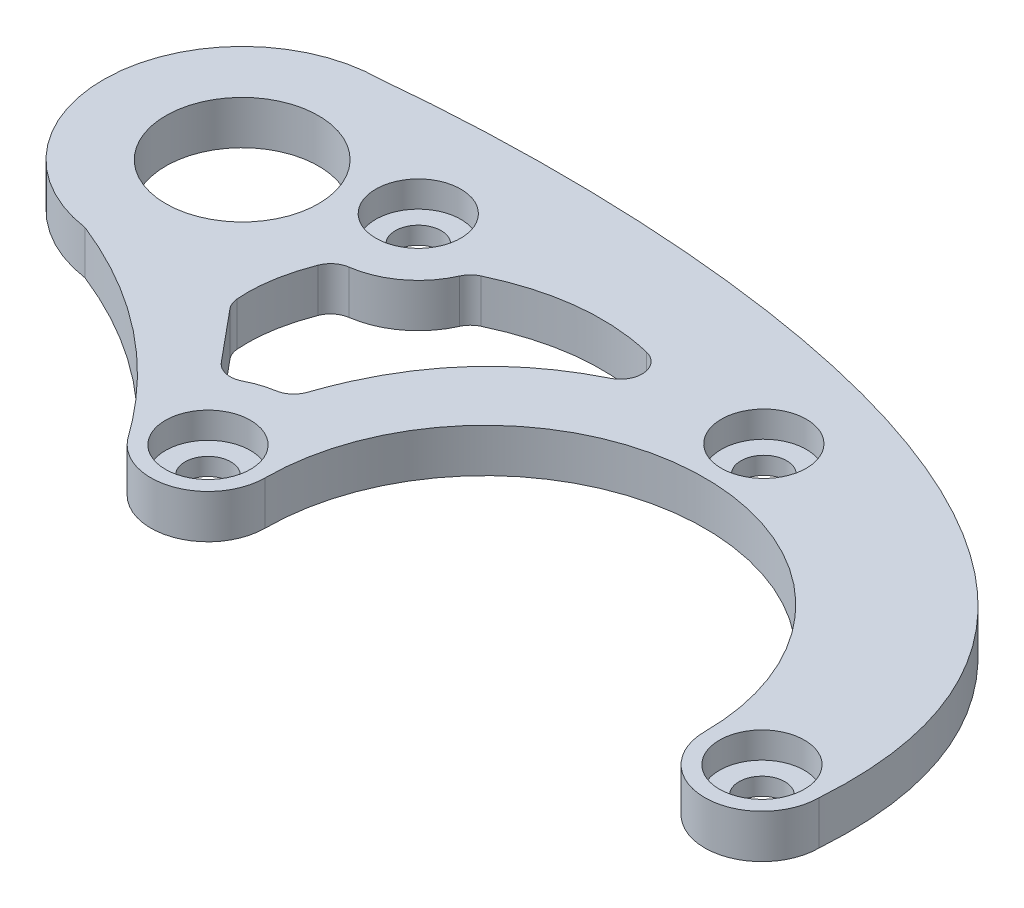
ISO-10303-21;
HEADER;
FILE_DESCRIPTION(('STEP AP214'),'2;1');
FILE_NAME('part.step','',(''),(''),'','','');
FILE_SCHEMA(('AUTOMOTIVE_DESIGN { 1 0 10303 214 1 1 1 1 }'));
ENDSEC;
DATA;
#1=APPLICATION_CONTEXT('core data for automotive mechanical design processes');
#2=APPLICATION_PROTOCOL_DEFINITION('international standard','automotive_design',2000,#1);
#3=PRODUCT_CONTEXT('',#1,'mechanical');
#4=PRODUCT('Part','Part','',(#3));
#5=PRODUCT_RELATED_PRODUCT_CATEGORY('part','',(#4));
#6=PRODUCT_DEFINITION_FORMATION('','',#4);
#7=PRODUCT_DEFINITION_CONTEXT('part definition',#1,'design');
#8=PRODUCT_DEFINITION('design','',#6,#7);
#9=PRODUCT_DEFINITION_SHAPE('','',#8);
#10=(LENGTH_UNIT() NAMED_UNIT(*) SI_UNIT(.MILLI.,.METRE.));
#11=(NAMED_UNIT(*) PLANE_ANGLE_UNIT() SI_UNIT($,.RADIAN.));
#12=(NAMED_UNIT(*) SI_UNIT($,.STERADIAN.) SOLID_ANGLE_UNIT());
#13=UNCERTAINTY_MEASURE_WITH_UNIT(LENGTH_MEASURE(1.E-05),#10,'distance_accuracy_value','');
#14=(GEOMETRIC_REPRESENTATION_CONTEXT(3) GLOBAL_UNCERTAINTY_ASSIGNED_CONTEXT((#13)) GLOBAL_UNIT_ASSIGNED_CONTEXT((#10,
#11,#12)) REPRESENTATION_CONTEXT('',''));
#15=CARTESIAN_POINT('',(0.,0.,0.));
#16=DIRECTION('',(0.,0.,1.));
#17=DIRECTION('',(1.,0.,0.));
#18=AXIS2_PLACEMENT_3D('',#15,#16,#17);
#19=CARTESIAN_POINT('',(-25.3999999999975,4.,0.));
#20=DIRECTION('',(0.,-1.,0.));
#21=DIRECTION('',(0.,0.,-1.));
#22=AXIS2_PLACEMENT_3D('',#19,#20,#21);
#23=CYLINDRICAL_SURFACE('',#22,2.1);
#24=CARTESIAN_POINT('',(-25.3999999999975,0.,0.));
#25=DIRECTION('',(0.,1.,0.));
#26=DIRECTION('',(0.,0.,1.));
#27=AXIS2_PLACEMENT_3D('',#24,#25,#26);
#28=CIRCLE('',#27,2.1);
#29=CARTESIAN_POINT('',(-25.3999999999975,0.,2.1));
#30=VERTEX_POINT('',#29);
#31=EDGE_CURVE('E370',#30,#30,#28,.T.);
#32=ORIENTED_EDGE('',*,*,#31,.F.);
#33=EDGE_LOOP('',(#32));
#34=FACE_BOUND('',#33,.T.);
#35=CARTESIAN_POINT('',(-25.3999999999975,1.6,0.));
#36=DIRECTION('',(0.,1.,0.));
#37=DIRECTION('',(0.,0.,1.));
#38=AXIS2_PLACEMENT_3D('',#35,#36,#37);
#39=CIRCLE('',#38,2.1);
#40=CARTESIAN_POINT('',(-25.3999999999975,1.6,2.1));
#41=VERTEX_POINT('',#40);
#42=EDGE_CURVE('E41',#41,#41,#39,.T.);
#43=ORIENTED_EDGE('',*,*,#42,.T.);
#44=EDGE_LOOP('',(#43));
#45=FACE_BOUND('',#44,.T.);
#46=ADVANCED_FACE('F37',(#34,#45),#23,.F.);
#47=CARTESIAN_POINT('',(25.4000000000025,4.,0.));
#48=DIRECTION('',(0.,-1.,0.));
#49=DIRECTION('',(0.,0.,-1.));
#50=AXIS2_PLACEMENT_3D('',#47,#48,#49);
#51=CYLINDRICAL_SURFACE('',#50,2.1);
#52=CARTESIAN_POINT('',(25.4000000000025,0.,0.));
#53=DIRECTION('',(0.,1.,0.));
#54=DIRECTION('',(0.,0.,1.));
#55=AXIS2_PLACEMENT_3D('',#52,#53,#54);
#56=CIRCLE('',#55,2.1);
#57=CARTESIAN_POINT('',(25.4000000000025,0.,2.09999999999999));
#58=VERTEX_POINT('',#57);
#59=EDGE_CURVE('E367',#58,#58,#56,.T.);
#60=ORIENTED_EDGE('',*,*,#59,.F.);
#61=EDGE_LOOP('',(#60));
#62=FACE_BOUND('',#61,.T.);
#63=CARTESIAN_POINT('',(25.4000000000025,1.6,0.));
#64=DIRECTION('',(0.,1.,0.));
#65=DIRECTION('',(0.,0.,1.));
#66=AXIS2_PLACEMENT_3D('',#63,#64,#65);
#67=CIRCLE('',#66,2.1);
#68=CARTESIAN_POINT('',(25.4000000000025,1.6,2.09999999999999));
#69=VERTEX_POINT('',#68);
#70=EDGE_CURVE('E468',#69,#69,#67,.T.);
#71=ORIENTED_EDGE('',*,*,#70,.T.);
#72=EDGE_LOOP('',(#71));
#73=FACE_BOUND('',#72,.T.);
#74=ADVANCED_FACE('F237',(#62,#73),#51,.F.);
#75=CARTESIAN_POINT('',(0.,4.,-25.5712769799823));
#76=DIRECTION('',(0.,-1.,0.));
#77=DIRECTION('',(0.,0.,-1.));
#78=AXIS2_PLACEMENT_3D('',#75,#76,#77);
#79=CYLINDRICAL_SURFACE('',#78,2.1);
#80=CARTESIAN_POINT('',(0.,0.,-25.5712769799823));
#81=DIRECTION('',(0.,1.,0.));
#82=DIRECTION('',(0.,0.,1.));
#83=AXIS2_PLACEMENT_3D('',#80,#81,#82);
#84=CIRCLE('',#83,2.1);
#85=CARTESIAN_POINT('',(0.,0.,-23.4712769799823));
#86=VERTEX_POINT('',#85);
#87=EDGE_CURVE('E364',#86,#86,#84,.T.);
#88=ORIENTED_EDGE('',*,*,#87,.F.);
#89=EDGE_LOOP('',(#88));
#90=FACE_BOUND('',#89,.T.);
#91=CARTESIAN_POINT('',(0.,1.6,-25.5712769799823));
#92=DIRECTION('',(0.,1.,0.));
#93=DIRECTION('',(0.,0.,1.));
#94=AXIS2_PLACEMENT_3D('',#91,#92,#93);
#95=CIRCLE('',#94,2.1);
#96=CARTESIAN_POINT('',(0.,1.6,-23.4712769799823));
#97=VERTEX_POINT('',#96);
#98=EDGE_CURVE('E465',#97,#97,#95,.T.);
#99=ORIENTED_EDGE('',*,*,#98,.T.);
#100=EDGE_LOOP('',(#99));
#101=FACE_BOUND('',#100,.T.);
#102=ADVANCED_FACE('F243',(#90,#101),#79,.F.);
#103=CARTESIAN_POINT('',(-34.1163474670303,4.,-28.0012344059499));
#104=DIRECTION('',(0.,-1.,0.));
#105=DIRECTION('',(0.,0.,-1.));
#106=AXIS2_PLACEMENT_3D('',#103,#104,#105);
#107=CYLINDRICAL_SURFACE('',#106,2.1);
#108=CARTESIAN_POINT('',(-34.1163474670303,0.,-28.0012344059499));
#109=DIRECTION('',(0.,1.,0.));
#110=DIRECTION('',(0.,0.,1.));
#111=AXIS2_PLACEMENT_3D('',#108,#109,#110);
#112=CIRCLE('',#111,2.1);
#113=CARTESIAN_POINT('',(-34.1163474670303,0.,-25.9012344059499));
#114=VERTEX_POINT('',#113);
#115=EDGE_CURVE('E361',#114,#114,#112,.T.);
#116=ORIENTED_EDGE('',*,*,#115,.F.);
#117=EDGE_LOOP('',(#116));
#118=FACE_BOUND('',#117,.T.);
#119=CARTESIAN_POINT('',(-34.1163474670303,1.6,-28.0012344059499));
#120=DIRECTION('',(0.,1.,0.));
#121=DIRECTION('',(0.,0.,1.));
#122=AXIS2_PLACEMENT_3D('',#119,#120,#121);
#123=CIRCLE('',#122,2.1);
#124=CARTESIAN_POINT('',(-34.1163474670303,1.6,-25.9012344059499));
#125=VERTEX_POINT('',#124);
#126=EDGE_CURVE('E462',#125,#125,#123,.T.);
#127=ORIENTED_EDGE('',*,*,#126,.T.);
#128=EDGE_LOOP('',(#127));
#129=FACE_BOUND('',#128,.T.);
#130=ADVANCED_FACE('F254',(#118,#129),#107,.F.);
#131=CARTESIAN_POINT('',(-27.0209047811942,4.,-25.5712769799823));
#132=CARTESIAN_POINT('',(-17.4025536822266,4.,-30.4955275976816));
#133=CARTESIAN_POINT('',(-7.5,4.,-25.5712769799823));
#134=B_SPLINE_CURVE_WITH_KNOTS('',2,(#131,#132,#133),.UNSPECIFIED.,.F.,.F.,(3,3),(0.,1.),.UNSPECIFIED.);
#135=DIRECTION('',(0.,-1.,0.));
#136=VECTOR('',#135,1.);
#137=SURFACE_OF_LINEAR_EXTRUSION('',#134,#136);
#138=CARTESIAN_POINT('',(-27.0209047811942,0.,-25.5712769799823));
#139=CARTESIAN_POINT('',(-17.4025536822266,0.,-30.4955275976816));
#140=CARTESIAN_POINT('',(-7.5,0.,-25.5712769799823));
#141=B_SPLINE_CURVE_WITH_KNOTS('',2,(#138,#139,#140),.UNSPECIFIED.,.F.,.F.,(3,3),(0.,1.),.UNSPECIFIED.);
#142=CARTESIAN_POINT('',(-26.3018637061405,0.,-25.9254523875965));
#143=VERTEX_POINT('',#142);
#144=CARTESIAN_POINT('',(-12.6504265022616,0.,-27.4710025798165));
#145=VERTEX_POINT('',#144);
#146=EDGE_CURVE('E376',#143,#145,#141,.T.);
#147=ORIENTED_EDGE('',*,*,#146,.T.);
#148=DIRECTION('',(0.,-1.,0.));
#149=VECTOR('',#148,1.);
#150=CARTESIAN_POINT('',(-12.6504265022616,0.,-27.4710025798165));
#151=LINE('',#150,#149);
#152=CARTESIAN_POINT('',(-12.6504265022616,4.,-27.4710025798165));
#153=VERTEX_POINT('',#152);
#154=EDGE_CURVE('E54',#145,#153,#151,.F.);
#155=ORIENTED_EDGE('',*,*,#154,.T.);
#156=CARTESIAN_POINT('',(-26.3018637061405,4.,-25.9254523875965));
#157=VERTEX_POINT('',#156);
#158=EDGE_CURVE('E291',#157,#153,#134,.T.);
#159=ORIENTED_EDGE('',*,*,#158,.F.);
#160=DIRECTION('',(0.,-1.,0.));
#161=VECTOR('',#160,1.);
#162=CARTESIAN_POINT('',(-26.3018637061392,4.,-25.9254523875971));
#163=LINE('',#162,#161);
#164=EDGE_CURVE('E437',#157,#143,#163,.T.);
#165=ORIENTED_EDGE('',*,*,#164,.T.);
#166=EDGE_LOOP('',(#147,#155,#159,#165));
#167=FACE_BOUND('',#166,.T.);
#168=ADVANCED_FACE('F258',(#167),#137,.F.);
#169=CARTESIAN_POINT('',(-7.5,4.,-25.5712769799823));
#170=CARTESIAN_POINT('',(-21.2937281832716,4.,-21.45737649119));
#171=CARTESIAN_POINT('',(-25.3999999999975,4.,-7.5));
#172=B_SPLINE_CURVE_WITH_KNOTS('',2,(#169,#170,#171),.UNSPECIFIED.,.F.,.F.,(3,3),(0.,1.),.UNSPECIFIED.);
#173=DIRECTION('',(0.,-1.,0.));
#174=VECTOR('',#173,1.);
#175=SURFACE_OF_LINEAR_EXTRUSION('',#172,#174);
#176=CARTESIAN_POINT('',(-7.5,0.,-25.5712769799823));
#177=CARTESIAN_POINT('',(-21.2937281832716,0.,-21.45737649119));
#178=CARTESIAN_POINT('',(-25.3999999999975,0.,-7.5));
#179=B_SPLINE_CURVE_WITH_KNOTS('',2,(#176,#177,#178),.UNSPECIFIED.,.F.,.F.,(3,3),(0.,1.),.UNSPECIFIED.);
#180=CARTESIAN_POINT('',(-12.232516986569,0.,-23.731788395496));
#181=VERTEX_POINT('',#180);
#182=CARTESIAN_POINT('',(-25.0086850834007,0.,-8.74257607753521));
#183=VERTEX_POINT('',#182);
#184=EDGE_CURVE('E380',#181,#183,#179,.T.);
#185=ORIENTED_EDGE('',*,*,#184,.T.);
#186=DIRECTION('',(0.,-1.,0.));
#187=VECTOR('',#186,1.);
#188=CARTESIAN_POINT('',(-25.0086850834007,0.,-8.74257607753522));
#189=LINE('',#188,#187);
#190=CARTESIAN_POINT('',(-25.0086850834007,4.,-8.74257607753521));
#191=VERTEX_POINT('',#190);
#192=EDGE_CURVE('E435',#183,#191,#189,.F.);
#193=ORIENTED_EDGE('',*,*,#192,.T.);
#194=CARTESIAN_POINT('',(-12.232516986569,4.,-23.731788395496));
#195=VERTEX_POINT('',#194);
#196=EDGE_CURVE('E296',#195,#191,#172,.T.);
#197=ORIENTED_EDGE('',*,*,#196,.F.);
#198=DIRECTION('',(0.,-1.,0.));
#199=VECTOR('',#198,1.);
#200=CARTESIAN_POINT('',(-12.232516986569,4.,-23.731788395496));
#201=LINE('',#200,#199);
#202=EDGE_CURVE('E432',#195,#181,#201,.T.);
#203=ORIENTED_EDGE('',*,*,#202,.T.);
#204=EDGE_LOOP('',(#185,#193,#197,#203));
#205=FACE_BOUND('',#204,.T.);
#206=ADVANCED_FACE('F306',(#205),#175,.F.);
#207=CARTESIAN_POINT('',(-25.3999999999975,4.,0.));
#208=DIRECTION('',(0.,-1.,0.));
#209=DIRECTION('',(0.,0.,-1.));
#210=AXIS2_PLACEMENT_3D('',#207,#208,#209);
#211=CYLINDRICAL_SURFACE('',#210,7.5);
#212=CARTESIAN_POINT('',(-25.3999999999975,0.,0.));
#213=DIRECTION('',(0.,1.,0.));
#214=DIRECTION('',(0.,0.,1.));
#215=AXIS2_PLACEMENT_3D('',#212,#213,#214);
#216=CIRCLE('',#215,7.5);
#217=CARTESIAN_POINT('',(-26.5876388488626,0.,-7.40537061629372));
#218=VERTEX_POINT('',#217);
#219=CARTESIAN_POINT('',(-28.8647121266464,0.,-6.6517493848951));
#220=VERTEX_POINT('',#219);
#221=EDGE_CURVE('E388',#218,#220,#216,.T.);
#222=ORIENTED_EDGE('',*,*,#221,.T.);
#223=DIRECTION('',(0.,-1.,0.));
#224=VECTOR('',#223,1.);
#225=CARTESIAN_POINT('',(-28.8647121266464,4.,-6.6517493848951));
#226=LINE('',#225,#224);
#227=CARTESIAN_POINT('',(-28.8647121266464,4.,-6.6517493848951));
#228=VERTEX_POINT('',#227);
#229=EDGE_CURVE('E430',#220,#228,#226,.F.);
#230=ORIENTED_EDGE('',*,*,#229,.T.);
#231=CARTESIAN_POINT('',(-25.3999999999975,4.,0.));
#232=DIRECTION('',(0.,1.,0.));
#233=DIRECTION('',(0.,0.,1.));
#234=AXIS2_PLACEMENT_3D('',#231,#232,#233);
#235=CIRCLE('',#234,7.5);
#236=CARTESIAN_POINT('',(-26.5876388488626,4.,-7.40537061629372));
#237=VERTEX_POINT('',#236);
#238=EDGE_CURVE('E748',#237,#228,#235,.T.);
#239=ORIENTED_EDGE('',*,*,#238,.F.);
#240=DIRECTION('',(0.,-1.,0.));
#241=VECTOR('',#240,1.);
#242=CARTESIAN_POINT('',(-26.5876388488626,4.,-7.40537061629372));
#243=LINE('',#242,#241);
#244=EDGE_CURVE('E427',#237,#218,#243,.T.);
#245=ORIENTED_EDGE('',*,*,#244,.T.);
#246=EDGE_LOOP('',(#222,#230,#239,#245));
#247=FACE_BOUND('',#246,.T.);
#248=ADVANCED_FACE('F309',(#247),#211,.T.);
#249=CARTESIAN_POINT('',(-15.0505789787791,4.,12.4805760469814));
#250=DIRECTION('',(0.769767808809611,0.,-0.638323993376757));
#251=DIRECTION('',(-0.638323993376757,0.,-0.769767808809611));
#252=AXIS2_PLACEMENT_3D('',#249,#250,#251);
#253=PLANE('',#252);
#254=DIRECTION('',(0.638323993376757,0.,0.769767808809611));
#255=VECTOR('',#254,1.);
#256=CARTESIAN_POINT('',(-15.0505789787791,0.,12.4805760469814));
#257=LINE('',#256,#255);
#258=CARTESIAN_POINT('',(-35.196792628699,0.,-11.8141502957834));
#259=VERTEX_POINT('',#258);
#260=CARTESIAN_POINT('',(-31.3281709780387,0.,-7.14890123411362));
#261=VERTEX_POINT('',#260);
#262=EDGE_CURVE('E394',#259,#261,#257,.T.);
#263=ORIENTED_EDGE('',*,*,#262,.F.);
#264=DIRECTION('',(0.,1.,0.));
#265=VECTOR('',#264,1.);
#266=CARTESIAN_POINT('',(-35.196792628699,4.,-11.8141502957834));
#267=LINE('',#266,#265);
#268=CARTESIAN_POINT('',(-35.196792628699,4.,-11.8141502957834));
#269=VERTEX_POINT('',#268);
#270=EDGE_CURVE('E425',#259,#269,#267,.T.);
#271=ORIENTED_EDGE('',*,*,#270,.T.);
#272=DIRECTION('',(0.638323993376757,0.,0.769767808809611));
#273=VECTOR('',#272,1.);
#274=CARTESIAN_POINT('',(-15.0505789787791,4.,12.4805760469814));
#275=LINE('',#274,#273);
#276=CARTESIAN_POINT('',(-31.3281709780387,4.,-7.14890123411362));
#277=VERTEX_POINT('',#276);
#278=EDGE_CURVE('E331',#269,#277,#275,.T.);
#279=ORIENTED_EDGE('',*,*,#278,.T.);
#280=DIRECTION('',(0.,-1.,0.));
#281=VECTOR('',#280,1.);
#282=CARTESIAN_POINT('',(-31.3281709780387,4.,-7.14890123411362));
#283=LINE('',#282,#281);
#284=EDGE_CURVE('E422',#277,#261,#283,.T.);
#285=ORIENTED_EDGE('',*,*,#284,.T.);
#286=EDGE_LOOP('',(#263,#271,#279,#285));
#287=FACE_BOUND('',#286,.T.);
#288=ADVANCED_FACE('F313',(#287),#253,.T.);
#289=CARTESIAN_POINT('',(-34.1163474670303,4.,-20.5012344059499));
#290=CARTESIAN_POINT('',(-35.4383344080648,4.,-17.6516968256018));
#291=CARTESIAN_POINT('',(-35.9271615945008,4.,-14.911178487714));
#292=CARTESIAN_POINT('',(-35.5828290263462,4.,-12.2796793923252));
#293=B_SPLINE_CURVE_WITH_KNOTS('',3,(#289,#290,#291,#292),.UNSPECIFIED.,.F.,.F.,(4,4),(0.,
0.482948312712918),.UNSPECIFIED.);
#294=DIRECTION('',(0.,-1.,0.));
#295=VECTOR('',#294,1.);
#296=SURFACE_OF_LINEAR_EXTRUSION('',#293,#295);
#297=CARTESIAN_POINT('',(-34.1163474670303,0.,-20.5012344059499));
#298=CARTESIAN_POINT('',(-35.4383344080648,0.,-17.6516968256018));
#299=CARTESIAN_POINT('',(-35.9271615945008,0.,-14.911178487714));
#300=CARTESIAN_POINT('',(-35.5828290263462,0.,-12.2796793923252));
#301=B_SPLINE_CURVE_WITH_KNOTS('',3,(#297,#298,#299,#300),.UNSPECIFIED.,.F.,.F.,(4,4),(0.,
0.482948312712918),.UNSPECIFIED.);
#302=CARTESIAN_POINT('',(-34.6185997254476,0.,-19.3211676042819));
#303=VERTEX_POINT('',#302);
#304=CARTESIAN_POINT('',(-35.6512170528469,0.,-12.9354813425851));
#305=VERTEX_POINT('',#304);
#306=EDGE_CURVE('E193',#303,#305,#301,.T.);
#307=ORIENTED_EDGE('',*,*,#306,.F.);
#308=DIRECTION('',(0.,-1.,0.));
#309=VECTOR('',#308,1.);
#310=CARTESIAN_POINT('',(-34.6185997254476,0.,-19.3211676042819));
#311=LINE('',#310,#309);
#312=CARTESIAN_POINT('',(-34.6185997254476,4.,-19.3211676042819));
#313=VERTEX_POINT('',#312);
#314=EDGE_CURVE('E420',#303,#313,#311,.F.);
#315=ORIENTED_EDGE('',*,*,#314,.T.);
#316=CARTESIAN_POINT('',(-35.6512170528469,4.,-12.9354813425851));
#317=VERTEX_POINT('',#316);
#318=EDGE_CURVE('E323',#313,#317,#293,.T.);
#319=ORIENTED_EDGE('',*,*,#318,.T.);
#320=DIRECTION('',(0.,-1.,0.));
#321=VECTOR('',#320,1.);
#322=CARTESIAN_POINT('',(-35.6512170528469,4.,-12.9354813425851));
#323=LINE('',#322,#321);
#324=EDGE_CURVE('E417',#317,#305,#323,.T.);
#325=ORIENTED_EDGE('',*,*,#324,.T.);
#326=EDGE_LOOP('',(#307,#315,#319,#325));
#327=FACE_BOUND('',#326,.T.);
#328=ADVANCED_FACE('F209',(#327),#296,.T.);
#329=CARTESIAN_POINT('',(-46.474516907735,4.,-36.9347627385625));
#330=CARTESIAN_POINT('',(-23.1642065675155,4.,-39.3518979463511));
#331=CARTESIAN_POINT('',(33.37390180074,4.,-38.120150772942));
#332=CARTESIAN_POINT('',(30.6437741851735,4.,0.));
#333=B_SPLINE_CURVE_WITH_KNOTS('',3,(#329,#330,#331,#332),.UNSPECIFIED.,.F.,.F.,(4,4),(0.,1.),.UNSPECIFIED.);
#334=DIRECTION('',(0.,-1.,0.));
#335=VECTOR('',#334,1.);
#336=SURFACE_OF_LINEAR_EXTRUSION('',#333,#335);
#337=CARTESIAN_POINT('',(-46.474516907735,0.,-36.9347627385625));
#338=CARTESIAN_POINT('',(-23.1642065675155,0.,-39.3518979463511));
#339=CARTESIAN_POINT('',(33.37390180074,0.,-38.120150772942));
#340=CARTESIAN_POINT('',(30.6437741851735,0.,0.));
#341=B_SPLINE_CURVE_WITH_KNOTS('',3,(#337,#338,#339,#340),.UNSPECIFIED.,.F.,.F.,(4,4),(0.,1.),.UNSPECIFIED.);
#342=CARTESIAN_POINT('',(-46.474516907735,0.,-36.9347627385625));
#343=VERTEX_POINT('',#342);
#344=CARTESIAN_POINT('',(30.6437741851735,0.,0.));
#345=VERTEX_POINT('',#344);
#346=EDGE_CURVE('E170',#343,#345,#341,.T.);
#347=ORIENTED_EDGE('',*,*,#346,.F.);
#348=DIRECTION('',(0.,-1.,0.));
#349=VECTOR('',#348,1.);
#350=CARTESIAN_POINT('',(-46.474516907735,4.,-36.9347627385625));
#351=LINE('',#350,#349);
#352=CARTESIAN_POINT('',(-46.474516907735,4.,-36.9347627385625));
#353=VERTEX_POINT('',#352);
#354=EDGE_CURVE('E164',#353,#343,#351,.T.);
#355=ORIENTED_EDGE('',*,*,#354,.F.);
#356=CARTESIAN_POINT('',(30.6437741851735,4.,0.));
#357=VERTEX_POINT('',#356);
#358=EDGE_CURVE('E168',#353,#357,#333,.T.);
#359=ORIENTED_EDGE('',*,*,#358,.T.);
#360=DIRECTION('',(0.,-1.,0.));
#361=VECTOR('',#360,1.);
#362=CARTESIAN_POINT('',(30.6437741851735,4.,0.));
#363=LINE('',#362,#361);
#364=EDGE_CURVE('E336',#357,#345,#363,.T.);
#365=ORIENTED_EDGE('',*,*,#364,.T.);
#366=EDGE_LOOP('',(#347,#355,#359,#365));
#367=FACE_BOUND('',#366,.T.);
#368=ADVANCED_FACE('F166',(#367),#336,.T.);
#369=CARTESIAN_POINT('',(-46.474516907735,4.,-24.2108132507691));
#370=DIRECTION('',(0.,-1.,0.));
#371=DIRECTION('',(0.,0.,-1.));
#372=AXIS2_PLACEMENT_3D('',#369,#370,#371);
#373=CYLINDRICAL_SURFACE('',#372,12.7239494877934);
#374=CARTESIAN_POINT('',(-46.474516907735,0.,-24.2108132507691));
#375=DIRECTION('',(0.,1.,0.));
#376=DIRECTION('',(0.,0.,1.));
#377=AXIS2_PLACEMENT_3D('',#374,#375,#376);
#378=CIRCLE('',#377,12.7239494877934);
#379=CARTESIAN_POINT('',(-48.2765327615463,0.,-11.6151144043164));
#380=VERTEX_POINT('',#379);
#381=EDGE_CURVE('E340',#343,#380,#378,.T.);
#382=ORIENTED_EDGE('',*,*,#381,.T.);
#383=DIRECTION('',(0.,-1.,0.));
#384=VECTOR('',#383,1.);
#385=CARTESIAN_POINT('',(-48.2765327615463,4.,-11.6151144043164));
#386=LINE('',#385,#384);
#387=CARTESIAN_POINT('',(-48.2765327615463,4.,-11.6151144043164));
#388=VERTEX_POINT('',#387);
#389=EDGE_CURVE('E174',#388,#380,#386,.T.);
#390=ORIENTED_EDGE('',*,*,#389,.F.);
#391=CARTESIAN_POINT('',(-46.474516907735,4.,-24.2108132507691));
#392=DIRECTION('',(0.,1.,0.));
#393=DIRECTION('',(0.,0.,1.));
#394=AXIS2_PLACEMENT_3D('',#391,#392,#393);
#395=CIRCLE('',#394,12.7239494877934);
#396=EDGE_CURVE('E177',#353,#388,#395,.T.);
#397=ORIENTED_EDGE('',*,*,#396,.F.);
#398=ORIENTED_EDGE('',*,*,#354,.T.);
#399=EDGE_LOOP('',(#382,#390,#397,#398));
#400=FACE_BOUND('',#399,.T.);
#401=ADVANCED_FACE('F178',(#400),#373,.T.);
#402=CARTESIAN_POINT('',(-48.2765327615463,4.,-11.6151144043164));
#403=CARTESIAN_POINT('',(-40.6636895412566,4.,-8.58381964627468));
#404=CARTESIAN_POINT('',(-34.4149934731786,4.,-3.63525751046167));
#405=CARTESIAN_POINT('',(-29.5304445567245,4.,3.23057200335661));
#406=B_SPLINE_CURVE_WITH_KNOTS('',3,(#402,#403,#404,#405),.UNSPECIFIED.,.F.,.F.,(4,4),
(0.15817400105,1.),.UNSPECIFIED.);
#407=DIRECTION('',(0.,-1.,0.));
#408=VECTOR('',#407,1.);
#409=SURFACE_OF_LINEAR_EXTRUSION('',#406,#408);
#410=CARTESIAN_POINT('',(-48.2765327615463,0.,-11.6151144043164));
#411=CARTESIAN_POINT('',(-40.6636895412566,0.,-8.58381964627468));
#412=CARTESIAN_POINT('',(-34.4149934731786,0.,-3.63525751046167));
#413=CARTESIAN_POINT('',(-29.5304445567245,0.,3.23057200335661));
#414=B_SPLINE_CURVE_WITH_KNOTS('',3,(#410,#411,#412,#413),.UNSPECIFIED.,.F.,.F.,(4,4),
(0.15817400105,1.),.UNSPECIFIED.);
#415=CARTESIAN_POINT('',(-29.5304445567245,0.,3.23057200335661));
#416=VERTEX_POINT('',#415);
#417=EDGE_CURVE('E345',#380,#416,#414,.T.);
#418=ORIENTED_EDGE('',*,*,#417,.T.);
#419=DIRECTION('',(0.,-1.,0.));
#420=VECTOR('',#419,1.);
#421=CARTESIAN_POINT('',(-29.5304445567245,4.,3.23057200335661));
#422=LINE('',#421,#420);
#423=CARTESIAN_POINT('',(-29.5304445567245,4.,3.23057200335661));
#424=VERTEX_POINT('',#423);
#425=EDGE_CURVE('E409',#424,#416,#422,.T.);
#426=ORIENTED_EDGE('',*,*,#425,.F.);
#427=EDGE_CURVE('E182',#388,#424,#406,.T.);
#428=ORIENTED_EDGE('',*,*,#427,.F.);
#429=ORIENTED_EDGE('',*,*,#389,.T.);
#430=EDGE_LOOP('',(#418,#426,#428,#429));
#431=FACE_BOUND('',#430,.T.);
#432=ADVANCED_FACE('F271',(#431),#409,.F.);
#433=CARTESIAN_POINT('',(-25.3999999999975,4.,0.));
#434=DIRECTION('',(0.,-1.,0.));
#435=DIRECTION('',(0.,0.,-1.));
#436=AXIS2_PLACEMENT_3D('',#433,#434,#435);
#437=CYLINDRICAL_SURFACE('',#436,5.24377418517108);
#438=CARTESIAN_POINT('',(-25.3999999999975,0.,0.));
#439=DIRECTION('',(0.,1.,0.));
#440=DIRECTION('',(0.,0.,1.));
#441=AXIS2_PLACEMENT_3D('',#438,#439,#440);
#442=CIRCLE('',#441,5.24377418517108);
#443=CARTESIAN_POINT('',(-20.1562258148265,0.,0.));
#444=VERTEX_POINT('',#443);
#445=EDGE_CURVE('E349',#416,#444,#442,.T.);
#446=ORIENTED_EDGE('',*,*,#445,.T.);
#447=DIRECTION('',(0.,-1.,0.));
#448=VECTOR('',#447,1.);
#449=CARTESIAN_POINT('',(-20.1562258148265,4.,0.));
#450=LINE('',#449,#448);
#451=CARTESIAN_POINT('',(-20.1562258148265,4.,0.));
#452=VERTEX_POINT('',#451);
#453=EDGE_CURVE('E407',#452,#444,#450,.T.);
#454=ORIENTED_EDGE('',*,*,#453,.F.);
#455=CARTESIAN_POINT('',(-25.3999999999975,4.,0.));
#456=DIRECTION('',(0.,1.,0.));
#457=DIRECTION('',(0.,0.,1.));
#458=AXIS2_PLACEMENT_3D('',#455,#456,#457);
#459=CIRCLE('',#458,5.24377418517108);
#460=EDGE_CURVE('E279',#424,#452,#459,.T.);
#461=ORIENTED_EDGE('',*,*,#460,.F.);
#462=ORIENTED_EDGE('',*,*,#425,.T.);
#463=EDGE_LOOP('',(#446,#454,#461,#462));
#464=FACE_BOUND('',#463,.T.);
#465=ADVANCED_FACE('F268',(#464),#437,.T.);
#466=CARTESIAN_POINT('',(2.46330733588707E-12,4.,0.));
#467=DIRECTION('',(0.,-1.,0.));
#468=DIRECTION('',(0.,0.,-1.));
#469=AXIS2_PLACEMENT_3D('',#466,#467,#468);
#470=CYLINDRICAL_SURFACE('',#469,20.1562258148289);
#471=CARTESIAN_POINT('',(2.46330733588707E-12,0.,0.));
#472=DIRECTION('',(0.,1.,0.));
#473=DIRECTION('',(0.,0.,1.));
#474=AXIS2_PLACEMENT_3D('',#471,#472,#473);
#475=CIRCLE('',#474,20.1562258148289);
#476=CARTESIAN_POINT('',(20.1562258148314,0.,0.));
#477=VERTEX_POINT('',#476);
#478=EDGE_CURVE('E355',#477,#444,#475,.T.);
#479=ORIENTED_EDGE('',*,*,#478,.F.);
#480=DIRECTION('',(0.,-1.,0.));
#481=VECTOR('',#480,1.);
#482=CARTESIAN_POINT('',(20.1562258148314,4.,0.));
#483=LINE('',#482,#481);
#484=CARTESIAN_POINT('',(20.1562258148314,4.,0.));
#485=VERTEX_POINT('',#484);
#486=EDGE_CURVE('E405',#485,#477,#483,.T.);
#487=ORIENTED_EDGE('',*,*,#486,.F.);
#488=CARTESIAN_POINT('',(2.46330733588707E-12,4.,0.));
#489=DIRECTION('',(0.,1.,0.));
#490=DIRECTION('',(0.,0.,1.));
#491=AXIS2_PLACEMENT_3D('',#488,#489,#490);
#492=CIRCLE('',#491,20.1562258148289);
#493=EDGE_CURVE('E284',#485,#452,#492,.T.);
#494=ORIENTED_EDGE('',*,*,#493,.T.);
#495=ORIENTED_EDGE('',*,*,#453,.T.);
#496=EDGE_LOOP('',(#479,#487,#494,#495));
#497=FACE_BOUND('',#496,.T.);
#498=ADVANCED_FACE('F265',(#497),#470,.F.);
#499=CARTESIAN_POINT('',(-46.474516907735,4.,-24.2108132507691));
#500=DIRECTION('',(0.,-1.,0.));
#501=DIRECTION('',(0.,0.,-1.));
#502=AXIS2_PLACEMENT_3D('',#499,#500,#501);
#503=CYLINDRICAL_SURFACE('',#502,6.99999999999944);
#504=CARTESIAN_POINT('',(-46.474516907735,4.,-24.2108132507691));
#505=DIRECTION('',(0.,1.,0.));
#506=DIRECTION('',(0.,0.,1.));
#507=AXIS2_PLACEMENT_3D('',#504,#505,#506);
#508=CIRCLE('',#507,6.99999999999944);
#509=CARTESIAN_POINT('',(-46.474516907735,4.,-17.2108132507697));
#510=VERTEX_POINT('',#509);
#511=EDGE_CURVE('E288',#510,#510,#508,.T.);
#512=ORIENTED_EDGE('',*,*,#511,.T.);
#513=EDGE_LOOP('',(#512));
#514=FACE_BOUND('',#513,.T.);
#515=CARTESIAN_POINT('',(-46.474516907735,0.,-24.2108132507691));
#516=DIRECTION('',(0.,1.,0.));
#517=DIRECTION('',(0.,0.,1.));
#518=AXIS2_PLACEMENT_3D('',#515,#516,#517);
#519=CIRCLE('',#518,6.99999999999944);
#520=CARTESIAN_POINT('',(-46.474516907735,0.,-17.2108132507697));
#521=VERTEX_POINT('',#520);
#522=EDGE_CURVE('E373',#521,#521,#519,.T.);
#523=ORIENTED_EDGE('',*,*,#522,.F.);
#524=EDGE_LOOP('',(#523));
#525=FACE_BOUND('',#524,.T.);
#526=ADVANCED_FACE('F249',(#514,#525),#503,.F.);
#527=CARTESIAN_POINT('',(25.4000000000025,4.,0.));
#528=DIRECTION('',(0.,-1.,0.));
#529=DIRECTION('',(0.,0.,-1.));
#530=AXIS2_PLACEMENT_3D('',#527,#528,#529);
#531=CYLINDRICAL_SURFACE('',#530,5.24377418517108);
#532=CARTESIAN_POINT('',(25.4000000000025,0.,0.));
#533=DIRECTION('',(0.,1.,0.));
#534=DIRECTION('',(0.,0.,1.));
#535=AXIS2_PLACEMENT_3D('',#532,#533,#534);
#536=CIRCLE('',#535,5.24377418517108);
#537=EDGE_CURVE('E358',#477,#345,#536,.T.);
#538=ORIENTED_EDGE('',*,*,#537,.T.);
#539=ORIENTED_EDGE('',*,*,#364,.F.);
#540=CARTESIAN_POINT('',(25.4000000000025,4.,0.));
#541=DIRECTION('',(0.,1.,0.));
#542=DIRECTION('',(0.,0.,1.));
#543=AXIS2_PLACEMENT_3D('',#540,#541,#542);
#544=CIRCLE('',#543,5.24377418517108);
#545=EDGE_CURVE('E188',#485,#357,#544,.T.);
#546=ORIENTED_EDGE('',*,*,#545,.F.);
#547=ORIENTED_EDGE('',*,*,#486,.T.);
#548=EDGE_LOOP('',(#538,#539,#546,#547));
#549=FACE_BOUND('',#548,.T.);
#550=ADVANCED_FACE('F260',(#549),#531,.T.);
#551=CARTESIAN_POINT('',(-34.1163474670303,4.,-28.0012344059499));
#552=DIRECTION('',(0.,-1.,0.));
#553=DIRECTION('',(0.,0.,-1.));
#554=AXIS2_PLACEMENT_3D('',#551,#552,#553);
#555=CYLINDRICAL_SURFACE('',#554,7.5);
#556=CARTESIAN_POINT('',(-34.1163474670303,4.,-28.0012344059499));
#557=DIRECTION('',(0.,1.,0.));
#558=DIRECTION('',(0.,0.,1.));
#559=AXIS2_PLACEMENT_3D('',#556,#557,#558);
#560=CIRCLE('',#559,7.5);
#561=CARTESIAN_POINT('',(-33.0402816164868,4.,-20.578830328746));
#562=VERTEX_POINT('',#561);
#563=CARTESIAN_POINT('',(-27.2716686492076,4.,-24.9352318161191));
#564=VERTEX_POINT('',#563);
#565=EDGE_CURVE('E330',#562,#564,#560,.T.);
#566=ORIENTED_EDGE('',*,*,#565,.F.);
#567=DIRECTION('',(0.,-1.,0.));
#568=VECTOR('',#567,1.);
#569=CARTESIAN_POINT('',(-33.0402816164868,4.,-20.578830328746));
#570=LINE('',#569,#568);
#571=CARTESIAN_POINT('',(-33.0402816164868,0.,-20.578830328746));
#572=VERTEX_POINT('',#571);
#573=EDGE_CURVE('E414',#562,#572,#570,.T.);
#574=ORIENTED_EDGE('',*,*,#573,.T.);
#575=CARTESIAN_POINT('',(-34.1163474670303,0.,-28.0012344059499));
#576=DIRECTION('',(0.,1.,0.));
#577=DIRECTION('',(0.,0.,1.));
#578=AXIS2_PLACEMENT_3D('',#575,#576,#577);
#579=CIRCLE('',#578,7.5);
#580=CARTESIAN_POINT('',(-27.2716686492076,0.,-24.9352318161191));
#581=VERTEX_POINT('',#580);
#582=EDGE_CURVE('E190',#572,#581,#579,.T.);
#583=ORIENTED_EDGE('',*,*,#582,.T.);
#584=DIRECTION('',(0.,-1.,0.));
#585=VECTOR('',#584,1.);
#586=CARTESIAN_POINT('',(-27.2716686492076,4.,-24.9352318161191));
#587=LINE('',#586,#585);
#588=EDGE_CURVE('E173',#581,#564,#587,.F.);
#589=ORIENTED_EDGE('',*,*,#588,.T.);
#590=EDGE_LOOP('',(#566,#574,#583,#589));
#591=FACE_BOUND('',#590,.T.);
#592=ADVANCED_FACE('F263',(#591),#555,.T.);
#593=CARTESIAN_POINT('',(0.,4.,0.));
#594=DIRECTION('',(0.,1.,0.));
#595=DIRECTION('',(0.,0.,1.));
#596=AXIS2_PLACEMENT_3D('',#593,#594,#595);
#597=PLANE('',#596);
#598=CARTESIAN_POINT('',(-34.1163474670303,4.,-28.0012344059499));
#599=DIRECTION('',(0.,1.,0.));
#600=DIRECTION('',(0.,0.,1.));
#601=AXIS2_PLACEMENT_3D('',#598,#599,#600);
#602=CIRCLE('',#601,3.9);
#603=CARTESIAN_POINT('',(-34.1163474670303,4.,-24.1012344059499));
#604=VERTEX_POINT('',#603);
#605=EDGE_CURVE('E543',#604,#604,#602,.T.);
#606=ORIENTED_EDGE('',*,*,#605,.F.);
#607=EDGE_LOOP('',(#606));
#608=FACE_BOUND('',#607,.T.);
#609=CARTESIAN_POINT('',(0.,4.,-25.5712769799823));
#610=DIRECTION('',(0.,1.,0.));
#611=DIRECTION('',(0.,0.,1.));
#612=AXIS2_PLACEMENT_3D('',#609,#610,#611);
#613=CIRCLE('',#612,3.9);
#614=CARTESIAN_POINT('',(0.,4.,-21.6712769799823));
#615=VERTEX_POINT('',#614);
#616=EDGE_CURVE('E485',#615,#615,#613,.T.);
#617=ORIENTED_EDGE('',*,*,#616,.F.);
#618=EDGE_LOOP('',(#617));
#619=FACE_BOUND('',#618,.T.);
#620=CARTESIAN_POINT('',(-25.3999999999975,4.,0.));
#621=DIRECTION('',(0.,1.,0.));
#622=DIRECTION('',(0.,0.,1.));
#623=AXIS2_PLACEMENT_3D('',#620,#621,#622);
#624=CIRCLE('',#623,3.9);
#625=CARTESIAN_POINT('',(-25.3999999999975,4.,3.9));
#626=VERTEX_POINT('',#625);
#627=EDGE_CURVE('E486',#626,#626,#624,.T.);
#628=ORIENTED_EDGE('',*,*,#627,.F.);
#629=EDGE_LOOP('',(#628));
#630=FACE_BOUND('',#629,.T.);
#631=CARTESIAN_POINT('',(25.4000000000025,4.,0.));
#632=DIRECTION('',(0.,1.,0.));
#633=DIRECTION('',(0.,0.,1.));
#634=AXIS2_PLACEMENT_3D('',#631,#632,#633);
#635=CIRCLE('',#634,3.9);
#636=CARTESIAN_POINT('',(25.4000000000025,4.,3.89999999999999));
#637=VERTEX_POINT('',#636);
#638=EDGE_CURVE('E199',#637,#637,#635,.T.);
#639=ORIENTED_EDGE('',*,*,#638,.F.);
#640=EDGE_LOOP('',(#639));
#641=FACE_BOUND('',#640,.T.);
#642=ORIENTED_EDGE('',*,*,#358,.F.);
#643=ORIENTED_EDGE('',*,*,#396,.T.);
#644=ORIENTED_EDGE('',*,*,#427,.T.);
#645=ORIENTED_EDGE('',*,*,#460,.T.);
#646=ORIENTED_EDGE('',*,*,#493,.F.);
#647=ORIENTED_EDGE('',*,*,#545,.T.);
#648=EDGE_LOOP('',(#642,#643,#644,#645,#646,#647));
#649=FACE_BOUND('',#648,.T.);
#650=ORIENTED_EDGE('',*,*,#511,.F.);
#651=EDGE_LOOP('',(#650));
#652=FACE_BOUND('',#651,.T.);
#653=ORIENTED_EDGE('',*,*,#565,.T.);
#654=CARTESIAN_POINT('',(-25.4464209644549,4.,-24.1176311254975));
#655=DIRECTION('',(0.,1.,0.));
#656=DIRECTION('',(0.,0.,1.));
#657=AXIS2_PLACEMENT_3D('',#654,#655,#656);
#658=CIRCLE('',#657,2.);
#659=EDGE_CURVE('E11',#564,#157,#658,.F.);
#660=ORIENTED_EDGE('',*,*,#659,.T.);
#661=ORIENTED_EDGE('',*,*,#158,.T.);
#662=CARTESIAN_POINT('',(-13.1161724025717,4.,-25.5259882466188));
#663=DIRECTION('',(0.,1.,0.));
#664=DIRECTION('',(0.,0.,1.));
#665=AXIS2_PLACEMENT_3D('',#662,#663,#664);
#666=CIRCLE('',#665,2.);
#667=EDGE_CURVE('E459',#153,#195,#666,.F.);
#668=ORIENTED_EDGE('',*,*,#667,.T.);
#669=ORIENTED_EDGE('',*,*,#196,.T.);
#670=CARTESIAN_POINT('',(-26.9043425418933,4.,-9.38013611397203));
#671=DIRECTION('',(0.,1.,0.));
#672=DIRECTION('',(0.,0.,1.));
#673=AXIS2_PLACEMENT_3D('',#670,#671,#672);
#674=CIRCLE('',#673,2.);
#675=EDGE_CURVE('E455',#191,#237,#674,.F.);
#676=ORIENTED_EDGE('',*,*,#675,.T.);
#677=ORIENTED_EDGE('',*,*,#238,.T.);
#678=CARTESIAN_POINT('',(-29.7886353604194,4.,-8.42554922086713));
#679=DIRECTION('',(0.,1.,0.));
#680=DIRECTION('',(0.,0.,1.));
#681=AXIS2_PLACEMENT_3D('',#678,#679,#680);
#682=CIRCLE('',#681,2.);
#683=EDGE_CURVE('E451',#228,#277,#682,.F.);
#684=ORIENTED_EDGE('',*,*,#683,.T.);
#685=ORIENTED_EDGE('',*,*,#278,.F.);
#686=CARTESIAN_POINT('',(-33.6572570110797,4.,-13.0907982825369));
#687=DIRECTION('',(0.,1.,0.));
#688=DIRECTION('',(0.,0.,1.));
#689=AXIS2_PLACEMENT_3D('',#686,#687,#688);
#690=CIRCLE('',#689,2.);
#691=EDGE_CURVE('E447',#269,#317,#690,.F.);
#692=ORIENTED_EDGE('',*,*,#691,.T.);
#693=ORIENTED_EDGE('',*,*,#318,.F.);
#694=CARTESIAN_POINT('',(-32.7533307230086,4.,-18.5995225748249));
#695=DIRECTION('',(0.,1.,0.));
#696=DIRECTION('',(0.,0.,1.));
#697=AXIS2_PLACEMENT_3D('',#694,#695,#696);
#698=CIRCLE('',#697,2.);
#699=EDGE_CURVE('E443',#313,#562,#698,.F.);
#700=ORIENTED_EDGE('',*,*,#699,.T.);
#701=EDGE_LOOP('',(#653,#660,#661,#668,#669,#676,#677,#684,#685,#692,#693,#700));
#702=FACE_BOUND('',#701,.T.);
#703=ADVANCED_FACE('F184',(#608,#619,#630,#641,#649,#652,#702),#597,.T.);
#704=CARTESIAN_POINT('',(0.,0.,0.));
#705=DIRECTION('',(0.,1.,0.));
#706=DIRECTION('',(0.,0.,1.));
#707=AXIS2_PLACEMENT_3D('',#704,#705,#706);
#708=PLANE('',#707);
#709=ORIENTED_EDGE('',*,*,#346,.T.);
#710=ORIENTED_EDGE('',*,*,#537,.F.);
#711=ORIENTED_EDGE('',*,*,#478,.T.);
#712=ORIENTED_EDGE('',*,*,#445,.F.);
#713=ORIENTED_EDGE('',*,*,#417,.F.);
#714=ORIENTED_EDGE('',*,*,#381,.F.);
#715=EDGE_LOOP('',(#709,#710,#711,#712,#713,#714));
#716=FACE_BOUND('',#715,.T.);
#717=ORIENTED_EDGE('',*,*,#115,.T.);
#718=EDGE_LOOP('',(#717));
#719=FACE_BOUND('',#718,.T.);
#720=ORIENTED_EDGE('',*,*,#87,.T.);
#721=EDGE_LOOP('',(#720));
#722=FACE_BOUND('',#721,.T.);
#723=ORIENTED_EDGE('',*,*,#59,.T.);
#724=EDGE_LOOP('',(#723));
#725=FACE_BOUND('',#724,.T.);
#726=ORIENTED_EDGE('',*,*,#31,.T.);
#727=EDGE_LOOP('',(#726));
#728=FACE_BOUND('',#727,.T.);
#729=ORIENTED_EDGE('',*,*,#522,.T.);
#730=EDGE_LOOP('',(#729));
#731=FACE_BOUND('',#730,.T.);
#732=ORIENTED_EDGE('',*,*,#146,.F.);
#733=CARTESIAN_POINT('',(-25.4464209644549,0.,-24.1176311254975));
#734=DIRECTION('',(0.,1.,0.));
#735=DIRECTION('',(0.,0.,1.));
#736=AXIS2_PLACEMENT_3D('',#733,#734,#735);
#737=CIRCLE('',#736,2.);
#738=EDGE_CURVE('E46',#143,#581,#737,.T.);
#739=ORIENTED_EDGE('',*,*,#738,.T.);
#740=ORIENTED_EDGE('',*,*,#582,.F.);
#741=CARTESIAN_POINT('',(-32.7533307230086,0.,-18.5995225748249));
#742=DIRECTION('',(0.,1.,0.));
#743=DIRECTION('',(0.,0.,1.));
#744=AXIS2_PLACEMENT_3D('',#741,#742,#743);
#745=CIRCLE('',#744,2.);
#746=EDGE_CURVE('E441',#572,#303,#745,.T.);
#747=ORIENTED_EDGE('',*,*,#746,.T.);
#748=ORIENTED_EDGE('',*,*,#306,.T.);
#749=CARTESIAN_POINT('',(-33.6572570110797,0.,-13.0907982825369));
#750=DIRECTION('',(0.,1.,0.));
#751=DIRECTION('',(0.,0.,1.));
#752=AXIS2_PLACEMENT_3D('',#749,#750,#751);
#753=CIRCLE('',#752,2.);
#754=EDGE_CURVE('E445',#305,#259,#753,.T.);
#755=ORIENTED_EDGE('',*,*,#754,.T.);
#756=ORIENTED_EDGE('',*,*,#262,.T.);
#757=CARTESIAN_POINT('',(-29.7886353604194,0.,-8.42554922086713));
#758=DIRECTION('',(0.,1.,0.));
#759=DIRECTION('',(0.,0.,1.));
#760=AXIS2_PLACEMENT_3D('',#757,#758,#759);
#761=CIRCLE('',#760,2.);
#762=EDGE_CURVE('E449',#261,#220,#761,.T.);
#763=ORIENTED_EDGE('',*,*,#762,.T.);
#764=ORIENTED_EDGE('',*,*,#221,.F.);
#765=CARTESIAN_POINT('',(-26.9043425418933,0.,-9.38013611397203));
#766=DIRECTION('',(0.,1.,0.));
#767=DIRECTION('',(0.,0.,1.));
#768=AXIS2_PLACEMENT_3D('',#765,#766,#767);
#769=CIRCLE('',#768,2.);
#770=EDGE_CURVE('E453',#218,#183,#769,.T.);
#771=ORIENTED_EDGE('',*,*,#770,.T.);
#772=ORIENTED_EDGE('',*,*,#184,.F.);
#773=CARTESIAN_POINT('',(-13.1161724025717,0.,-25.5259882466188));
#774=DIRECTION('',(0.,1.,0.));
#775=DIRECTION('',(0.,0.,1.));
#776=AXIS2_PLACEMENT_3D('',#773,#774,#775);
#777=CIRCLE('',#776,2.);
#778=EDGE_CURVE('E457',#181,#145,#777,.T.);
#779=ORIENTED_EDGE('',*,*,#778,.T.);
#780=EDGE_LOOP('',(#732,#739,#740,#747,#748,#755,#756,#763,#764,#771,#772,#779));
#781=FACE_BOUND('',#780,.T.);
#782=ADVANCED_FACE('F215',(#716,#719,#722,#725,#728,#731,#781),#708,.F.);
#783=CARTESIAN_POINT('',(-32.7533307230086,2.,-18.5995225748249));
#784=DIRECTION('',(0.,-1.,0.));
#785=DIRECTION('',(0.,0.,-1.));
#786=AXIS2_PLACEMENT_3D('',#783,#784,#785);
#787=CYLINDRICAL_SURFACE('',#786,2.);
#788=ORIENTED_EDGE('',*,*,#699,.F.);
#789=ORIENTED_EDGE('',*,*,#314,.F.);
#790=ORIENTED_EDGE('',*,*,#746,.F.);
#791=ORIENTED_EDGE('',*,*,#573,.F.);
#792=EDGE_LOOP('',(#788,#789,#790,#791));
#793=FACE_BOUND('',#792,.T.);
#794=ADVANCED_FACE('F211',(#793),#787,.F.);
#795=CARTESIAN_POINT('',(-33.6572570110797,2.,-13.0907982825369));
#796=DIRECTION('',(0.,-1.,0.));
#797=DIRECTION('',(0.,0.,-1.));
#798=AXIS2_PLACEMENT_3D('',#795,#796,#797);
#799=CYLINDRICAL_SURFACE('',#798,2.);
#800=ORIENTED_EDGE('',*,*,#691,.F.);
#801=ORIENTED_EDGE('',*,*,#270,.F.);
#802=ORIENTED_EDGE('',*,*,#754,.F.);
#803=ORIENTED_EDGE('',*,*,#324,.F.);
#804=EDGE_LOOP('',(#800,#801,#802,#803));
#805=FACE_BOUND('',#804,.T.);
#806=ADVANCED_FACE('F214',(#805),#799,.F.);
#807=CARTESIAN_POINT('',(-29.7886353604194,4.,-8.42554922086713));
#808=DIRECTION('',(0.,-1.,0.));
#809=DIRECTION('',(0.,0.,-1.));
#810=AXIS2_PLACEMENT_3D('',#807,#808,#809);
#811=CYLINDRICAL_SURFACE('',#810,2.);
#812=ORIENTED_EDGE('',*,*,#683,.F.);
#813=ORIENTED_EDGE('',*,*,#229,.F.);
#814=ORIENTED_EDGE('',*,*,#762,.F.);
#815=ORIENTED_EDGE('',*,*,#284,.F.);
#816=EDGE_LOOP('',(#812,#813,#814,#815));
#817=FACE_BOUND('',#816,.T.);
#818=ADVANCED_FACE('F219',(#817),#811,.F.);
#819=CARTESIAN_POINT('',(-26.9043425418933,2.,-9.38013611397203));
#820=DIRECTION('',(0.,-1.,0.));
#821=DIRECTION('',(0.,0.,-1.));
#822=AXIS2_PLACEMENT_3D('',#819,#820,#821);
#823=CYLINDRICAL_SURFACE('',#822,2.);
#824=ORIENTED_EDGE('',*,*,#675,.F.);
#825=ORIENTED_EDGE('',*,*,#192,.F.);
#826=ORIENTED_EDGE('',*,*,#770,.F.);
#827=ORIENTED_EDGE('',*,*,#244,.F.);
#828=EDGE_LOOP('',(#824,#825,#826,#827));
#829=FACE_BOUND('',#828,.T.);
#830=ADVANCED_FACE('F223',(#829),#823,.F.);
#831=CARTESIAN_POINT('',(-13.1161724025717,2.,-25.5259882466188));
#832=DIRECTION('',(0.,-1.,0.));
#833=DIRECTION('',(0.,0.,-1.));
#834=AXIS2_PLACEMENT_3D('',#831,#832,#833);
#835=CYLINDRICAL_SURFACE('',#834,2.);
#836=ORIENTED_EDGE('',*,*,#667,.F.);
#837=ORIENTED_EDGE('',*,*,#154,.F.);
#838=ORIENTED_EDGE('',*,*,#778,.F.);
#839=ORIENTED_EDGE('',*,*,#202,.F.);
#840=EDGE_LOOP('',(#836,#837,#838,#839));
#841=FACE_BOUND('',#840,.T.);
#842=ADVANCED_FACE('F226',(#841),#835,.F.);
#843=CARTESIAN_POINT('',(-25.4464209644549,2.,-24.1176311254975));
#844=DIRECTION('',(0.,-1.,0.));
#845=DIRECTION('',(0.,0.,-1.));
#846=AXIS2_PLACEMENT_3D('',#843,#844,#845);
#847=CYLINDRICAL_SURFACE('',#846,2.);
#848=ORIENTED_EDGE('',*,*,#659,.F.);
#849=ORIENTED_EDGE('',*,*,#588,.F.);
#850=ORIENTED_EDGE('',*,*,#738,.F.);
#851=ORIENTED_EDGE('',*,*,#164,.F.);
#852=EDGE_LOOP('',(#848,#849,#850,#851));
#853=FACE_BOUND('',#852,.T.);
#854=ADVANCED_FACE('F39',(#853),#847,.F.);
#855=CARTESIAN_POINT('',(25.4000000000025,1.6,0.));
#856=DIRECTION('',(0.,1.,0.));
#857=DIRECTION('',(0.,0.,1.));
#858=AXIS2_PLACEMENT_3D('',#855,#856,#857);
#859=CYLINDRICAL_SURFACE('',#858,3.9);
#860=CARTESIAN_POINT('',(25.4000000000025,1.6,0.));
#861=DIRECTION('',(0.,1.,0.));
#862=DIRECTION('',(0.,0.,1.));
#863=AXIS2_PLACEMENT_3D('',#860,#861,#862);
#864=CIRCLE('',#863,3.9);
#865=CARTESIAN_POINT('',(25.4000000000025,1.6,3.89999999999999));
#866=VERTEX_POINT('',#865);
#867=EDGE_CURVE('E492',#866,#866,#864,.T.);
#868=ORIENTED_EDGE('',*,*,#867,.F.);
#869=EDGE_LOOP('',(#868));
#870=FACE_BOUND('',#869,.T.);
#871=ORIENTED_EDGE('',*,*,#638,.T.);
#872=EDGE_LOOP('',(#871));
#873=FACE_BOUND('',#872,.T.);
#874=ADVANCED_FACE('F233',(#870,#873),#859,.F.);
#875=CARTESIAN_POINT('',(25.4000000000025,1.6,0.));
#876=DIRECTION('',(0.,1.,0.));
#877=DIRECTION('',(0.,0.,1.));
#878=AXIS2_PLACEMENT_3D('',#875,#876,#877);
#879=PLANE('',#878);
#880=ORIENTED_EDGE('',*,*,#70,.F.);
#881=EDGE_LOOP('',(#880));
#882=FACE_BOUND('',#881,.T.);
#883=ORIENTED_EDGE('',*,*,#867,.T.);
#884=EDGE_LOOP('',(#883));
#885=FACE_BOUND('',#884,.T.);
#886=ADVANCED_FACE('F516',(#882,#885),#879,.T.);
#887=CARTESIAN_POINT('',(-25.3999999999975,1.6,0.));
#888=DIRECTION('',(0.,1.,0.));
#889=DIRECTION('',(0.,0.,1.));
#890=AXIS2_PLACEMENT_3D('',#887,#888,#889);
#891=CYLINDRICAL_SURFACE('',#890,3.9);
#892=CARTESIAN_POINT('',(-25.3999999999975,1.6,0.));
#893=DIRECTION('',(0.,1.,0.));
#894=DIRECTION('',(0.,0.,1.));
#895=AXIS2_PLACEMENT_3D('',#892,#893,#894);
#896=CIRCLE('',#895,3.9);
#897=CARTESIAN_POINT('',(-25.3999999999975,1.6,3.9));
#898=VERTEX_POINT('',#897);
#899=EDGE_CURVE('E483',#898,#898,#896,.T.);
#900=ORIENTED_EDGE('',*,*,#899,.F.);
#901=EDGE_LOOP('',(#900));
#902=FACE_BOUND('',#901,.T.);
#903=ORIENTED_EDGE('',*,*,#627,.T.);
#904=EDGE_LOOP('',(#903));
#905=FACE_BOUND('',#904,.T.);
#906=ADVANCED_FACE('F479',(#902,#905),#891,.F.);
#907=CARTESIAN_POINT('',(-25.3999999999975,1.6,0.));
#908=DIRECTION('',(0.,1.,0.));
#909=DIRECTION('',(0.,0.,1.));
#910=AXIS2_PLACEMENT_3D('',#907,#908,#909);
#911=PLANE('',#910);
#912=ORIENTED_EDGE('',*,*,#42,.F.);
#913=EDGE_LOOP('',(#912));
#914=FACE_BOUND('',#913,.T.);
#915=ORIENTED_EDGE('',*,*,#899,.T.);
#916=EDGE_LOOP('',(#915));
#917=FACE_BOUND('',#916,.T.);
#918=ADVANCED_FACE('F475',(#914,#917),#911,.T.);
#919=CARTESIAN_POINT('',(0.,1.6,-25.5712769799823));
#920=DIRECTION('',(0.,1.,0.));
#921=DIRECTION('',(0.,0.,1.));
#922=AXIS2_PLACEMENT_3D('',#919,#920,#921);
#923=CYLINDRICAL_SURFACE('',#922,3.9);
#924=CARTESIAN_POINT('',(0.,1.6,-25.5712769799823));
#925=DIRECTION('',(0.,1.,0.));
#926=DIRECTION('',(0.,0.,1.));
#927=AXIS2_PLACEMENT_3D('',#924,#925,#926);
#928=CIRCLE('',#927,3.9);
#929=CARTESIAN_POINT('',(0.,1.6,-21.6712769799823));
#930=VERTEX_POINT('',#929);
#931=EDGE_CURVE('E489',#930,#930,#928,.T.);
#932=ORIENTED_EDGE('',*,*,#931,.F.);
#933=EDGE_LOOP('',(#932));
#934=FACE_BOUND('',#933,.T.);
#935=ORIENTED_EDGE('',*,*,#616,.T.);
#936=EDGE_LOOP('',(#935));
#937=FACE_BOUND('',#936,.T.);
#938=ADVANCED_FACE('F478',(#934,#937),#923,.F.);
#939=CARTESIAN_POINT('',(0.,1.6,-25.5712769799823));
#940=DIRECTION('',(0.,1.,0.));
#941=DIRECTION('',(0.,0.,1.));
#942=AXIS2_PLACEMENT_3D('',#939,#940,#941);
#943=PLANE('',#942);
#944=ORIENTED_EDGE('',*,*,#98,.F.);
#945=EDGE_LOOP('',(#944));
#946=FACE_BOUND('',#945,.T.);
#947=ORIENTED_EDGE('',*,*,#931,.T.);
#948=EDGE_LOOP('',(#947));
#949=FACE_BOUND('',#948,.T.);
#950=ADVANCED_FACE('F525',(#946,#949),#943,.T.);
#951=CARTESIAN_POINT('',(-34.1163474670303,1.6,-28.0012344059499));
#952=DIRECTION('',(0.,1.,0.));
#953=DIRECTION('',(0.,0.,1.));
#954=AXIS2_PLACEMENT_3D('',#951,#952,#953);
#955=CYLINDRICAL_SURFACE('',#954,3.9);
#956=CARTESIAN_POINT('',(-34.1163474670303,1.6,-28.0012344059499));
#957=DIRECTION('',(0.,1.,0.));
#958=DIRECTION('',(0.,0.,1.));
#959=AXIS2_PLACEMENT_3D('',#956,#957,#958);
#960=CIRCLE('',#959,3.9);
#961=CARTESIAN_POINT('',(-34.1163474670303,1.6,-24.1012344059499));
#962=VERTEX_POINT('',#961);
#963=EDGE_CURVE('E466',#962,#962,#960,.T.);
#964=ORIENTED_EDGE('',*,*,#963,.F.);
#965=EDGE_LOOP('',(#964));
#966=FACE_BOUND('',#965,.T.);
#967=ORIENTED_EDGE('',*,*,#605,.T.);
#968=EDGE_LOOP('',(#967));
#969=FACE_BOUND('',#968,.T.);
#970=ADVANCED_FACE('F529',(#966,#969),#955,.F.);
#971=CARTESIAN_POINT('',(-34.1163474670303,1.6,-28.0012344059499));
#972=DIRECTION('',(0.,1.,0.));
#973=DIRECTION('',(0.,0.,1.));
#974=AXIS2_PLACEMENT_3D('',#971,#972,#973);
#975=PLANE('',#974);
#976=ORIENTED_EDGE('',*,*,#126,.F.);
#977=EDGE_LOOP('',(#976));
#978=FACE_BOUND('',#977,.T.);
#979=ORIENTED_EDGE('',*,*,#963,.T.);
#980=EDGE_LOOP('',(#979));
#981=FACE_BOUND('',#980,.T.);
#982=ADVANCED_FACE('F533',(#978,#981),#975,.T.);
#983=CLOSED_SHELL('',(#46,#74,#102,#130,#168,#206,#248,#288,#328,#368,#401,#432,#465,#498,#526,
#550,#592,#703,#782,#794,#806,#818,#830,#842,#854,#874,#886,#906,#918,#938,#950,#970,#982));
#984=MANIFOLD_SOLID_BREP('B2',#983);
#985=ADVANCED_BREP_SHAPE_REPRESENTATION('',(#18,#984),#14);
#986=SHAPE_DEFINITION_REPRESENTATION(#9,#985);
ENDSEC;
END-ISO-10303-21;
